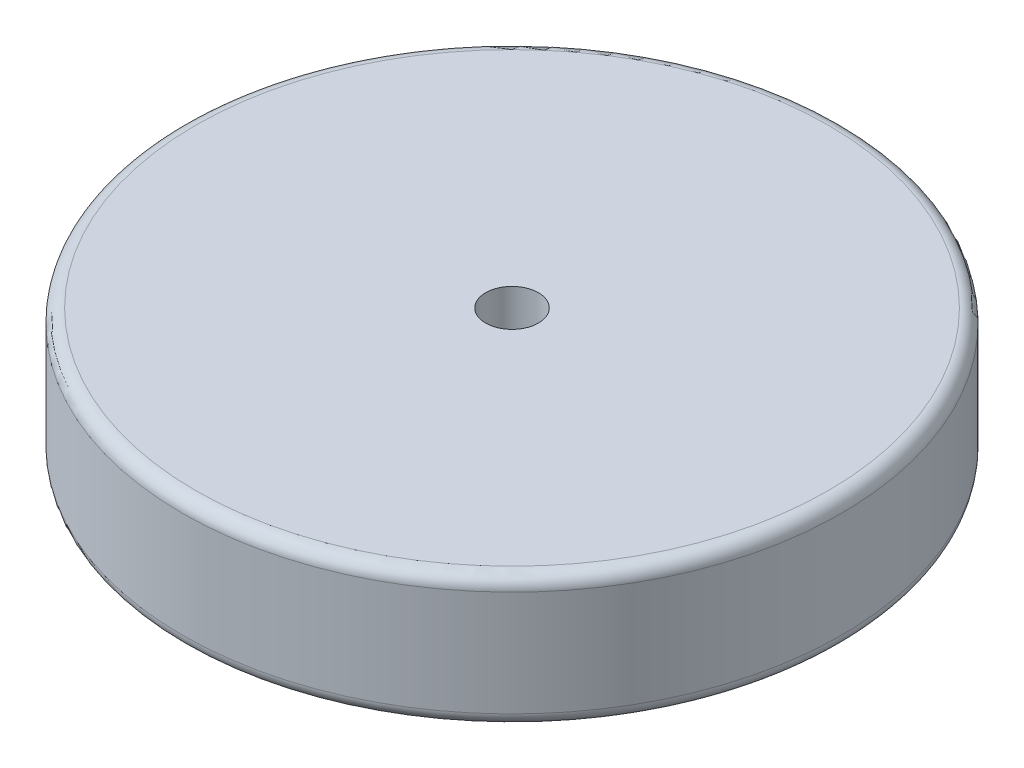
ISO-10303-21;
HEADER;
FILE_DESCRIPTION(('STEP AP214'),'2;1');
FILE_NAME('part.step','',(''),(''),'','','');
FILE_SCHEMA(('AUTOMOTIVE_DESIGN { 1 0 10303 214 1 1 1 1 }'));
ENDSEC;
DATA;
#1=APPLICATION_CONTEXT('core data for automotive mechanical design processes');
#2=APPLICATION_PROTOCOL_DEFINITION('international standard','automotive_design',2000,#1);
#3=PRODUCT_CONTEXT('',#1,'mechanical');
#4=PRODUCT('Part','Part','',(#3));
#5=PRODUCT_RELATED_PRODUCT_CATEGORY('part','',(#4));
#6=PRODUCT_DEFINITION_FORMATION('','',#4);
#7=PRODUCT_DEFINITION_CONTEXT('part definition',#1,'design');
#8=PRODUCT_DEFINITION('design','',#6,#7);
#9=PRODUCT_DEFINITION_SHAPE('','',#8);
#10=(LENGTH_UNIT() NAMED_UNIT(*) SI_UNIT(.MILLI.,.METRE.));
#11=(NAMED_UNIT(*) PLANE_ANGLE_UNIT() SI_UNIT($,.RADIAN.));
#12=(NAMED_UNIT(*) SI_UNIT($,.STERADIAN.) SOLID_ANGLE_UNIT());
#13=UNCERTAINTY_MEASURE_WITH_UNIT(LENGTH_MEASURE(1.E-05),#10,'distance_accuracy_value','');
#14=(GEOMETRIC_REPRESENTATION_CONTEXT(3) GLOBAL_UNCERTAINTY_ASSIGNED_CONTEXT((#13)) GLOBAL_UNIT_ASSIGNED_CONTEXT((#10,
#11,#12)) REPRESENTATION_CONTEXT('',''));
#15=CARTESIAN_POINT('',(0.,0.,0.));
#16=DIRECTION('',(0.,0.,1.));
#17=DIRECTION('',(1.,0.,0.));
#18=AXIS2_PLACEMENT_3D('',#15,#16,#17);
#19=CARTESIAN_POINT('',(0.,10.,0.));
#20=DIRECTION('',(0.,1.,0.));
#21=DIRECTION('',(0.,0.,1.));
#22=AXIS2_PLACEMENT_3D('',#19,#20,#21);
#23=PLANE('',#22);
#24=CARTESIAN_POINT('',(0.,10.,0.));
#25=DIRECTION('',(0.,1.,0.));
#26=DIRECTION('',(0.,0.,1.));
#27=AXIS2_PLACEMENT_3D('',#24,#25,#26);
#28=CIRCLE('',#27,24.);
#29=CARTESIAN_POINT('',(0.,10.,24.));
#30=VERTEX_POINT('',#29);
#31=EDGE_CURVE('E10',#30,#30,#28,.T.);
#32=ORIENTED_EDGE('',*,*,#31,.T.);
#33=EDGE_LOOP('',(#32));
#34=FACE_BOUND('',#33,.T.);
#35=CARTESIAN_POINT('',(0.,10.,0.));
#36=DIRECTION('',(0.,1.,0.));
#37=DIRECTION('',(0.,0.,1.));
#38=AXIS2_PLACEMENT_3D('',#35,#36,#37);
#39=CIRCLE('',#38,2.);
#40=CARTESIAN_POINT('',(0.,10.,2.));
#41=VERTEX_POINT('',#40);
#42=EDGE_CURVE('E51',#41,#41,#39,.T.);
#43=ORIENTED_EDGE('',*,*,#42,.F.);
#44=EDGE_LOOP('',(#43));
#45=FACE_BOUND('',#44,.T.);
#46=ADVANCED_FACE('F31',(#34,#45),#23,.T.);
#47=CARTESIAN_POINT('',(0.,0.,0.));
#48=DIRECTION('',(0.,1.,0.));
#49=DIRECTION('',(0.,0.,1.));
#50=AXIS2_PLACEMENT_3D('',#47,#48,#49);
#51=PLANE('',#50);
#52=CARTESIAN_POINT('',(0.,0.,0.));
#53=DIRECTION('',(0.,1.,0.));
#54=DIRECTION('',(0.,0.,1.));
#55=AXIS2_PLACEMENT_3D('',#52,#53,#54);
#56=CIRCLE('',#55,24.);
#57=CARTESIAN_POINT('',(0.,0.,24.));
#58=VERTEX_POINT('',#57);
#59=EDGE_CURVE('E38',#58,#58,#56,.F.);
#60=ORIENTED_EDGE('',*,*,#59,.T.);
#61=EDGE_LOOP('',(#60));
#62=FACE_BOUND('',#61,.T.);
#63=CARTESIAN_POINT('',(0.,0.,0.));
#64=DIRECTION('',(0.,1.,0.));
#65=DIRECTION('',(0.,0.,1.));
#66=AXIS2_PLACEMENT_3D('',#63,#64,#65);
#67=CIRCLE('',#66,2.);
#68=CARTESIAN_POINT('',(0.,0.,2.));
#69=VERTEX_POINT('',#68);
#70=EDGE_CURVE('E52',#69,#69,#67,.T.);
#71=ORIENTED_EDGE('',*,*,#70,.T.);
#72=EDGE_LOOP('',(#71));
#73=FACE_BOUND('',#72,.T.);
#74=ADVANCED_FACE('F62',(#62,#73),#51,.F.);
#75=CARTESIAN_POINT('',(0.,10.,0.));
#76=DIRECTION('',(0.,-1.,0.));
#77=DIRECTION('',(0.,0.,-1.));
#78=AXIS2_PLACEMENT_3D('',#75,#76,#77);
#79=CYLINDRICAL_SURFACE('',#78,25.);
#80=CARTESIAN_POINT('',(0.,0.999999999999999,0.));
#81=DIRECTION('',(0.,1.,0.));
#82=DIRECTION('',(0.,0.,1.));
#83=AXIS2_PLACEMENT_3D('',#80,#81,#82);
#84=CIRCLE('',#83,25.);
#85=CARTESIAN_POINT('',(0.,0.999999999999999,25.));
#86=VERTEX_POINT('',#85);
#87=EDGE_CURVE('E42',#86,#86,#84,.T.);
#88=ORIENTED_EDGE('',*,*,#87,.T.);
#89=EDGE_LOOP('',(#88));
#90=FACE_BOUND('',#89,.T.);
#91=CARTESIAN_POINT('',(0.,9.,0.));
#92=DIRECTION('',(0.,1.,0.));
#93=DIRECTION('',(0.,0.,1.));
#94=AXIS2_PLACEMENT_3D('',#91,#92,#93);
#95=CIRCLE('',#94,25.);
#96=CARTESIAN_POINT('',(0.,9.,25.));
#97=VERTEX_POINT('',#96);
#98=EDGE_CURVE('E46',#97,#97,#95,.F.);
#99=ORIENTED_EDGE('',*,*,#98,.T.);
#100=EDGE_LOOP('',(#99));
#101=FACE_BOUND('',#100,.T.);
#102=ADVANCED_FACE('F67',(#90,#101),#79,.T.);
#103=CARTESIAN_POINT('',(0.,10.,0.));
#104=DIRECTION('',(0.,-1.,0.));
#105=DIRECTION('',(0.,0.,-1.));
#106=AXIS2_PLACEMENT_3D('',#103,#104,#105);
#107=CYLINDRICAL_SURFACE('',#106,2.);
#108=ORIENTED_EDGE('',*,*,#42,.T.);
#109=EDGE_LOOP('',(#108));
#110=FACE_BOUND('',#109,.T.);
#111=ORIENTED_EDGE('',*,*,#70,.F.);
#112=EDGE_LOOP('',(#111));
#113=FACE_BOUND('',#112,.T.);
#114=ADVANCED_FACE('F58',(#110,#113),#107,.F.);
#115=CARTESIAN_POINT('',(0.,0.999999999999999,0.));
#116=DIRECTION('',(0.,1.,0.));
#117=DIRECTION('',(0.,0.,1.));
#118=AXIS2_PLACEMENT_3D('',#115,#116,#117);
#119=TOROIDAL_SURFACE('',#118,24.,1.);
#120=ORIENTED_EDGE('',*,*,#59,.F.);
#121=EDGE_LOOP('',(#120));
#122=FACE_BOUND('',#121,.T.);
#123=ORIENTED_EDGE('',*,*,#87,.F.);
#124=EDGE_LOOP('',(#123));
#125=FACE_BOUND('',#124,.T.);
#126=ADVANCED_FACE('F73',(#122,#125),#119,.T.);
#127=CARTESIAN_POINT('',(0.,9.,0.));
#128=DIRECTION('',(0.,1.,0.));
#129=DIRECTION('',(0.,0.,1.));
#130=AXIS2_PLACEMENT_3D('',#127,#128,#129);
#131=TOROIDAL_SURFACE('',#130,24.,1.);
#132=ORIENTED_EDGE('',*,*,#98,.F.);
#133=EDGE_LOOP('',(#132));
#134=FACE_BOUND('',#133,.T.);
#135=ORIENTED_EDGE('',*,*,#31,.F.);
#136=EDGE_LOOP('',(#135));
#137=FACE_BOUND('',#136,.T.);
#138=ADVANCED_FACE('F33',(#134,#137),#131,.T.);
#139=CLOSED_SHELL('',(#46,#74,#102,#114,#126,#138));
#140=MANIFOLD_SOLID_BREP('B2',#139);
#141=ADVANCED_BREP_SHAPE_REPRESENTATION('',(#18,#140),#14);
#142=SHAPE_DEFINITION_REPRESENTATION(#9,#141);
ENDSEC;
END-ISO-10303-21;
